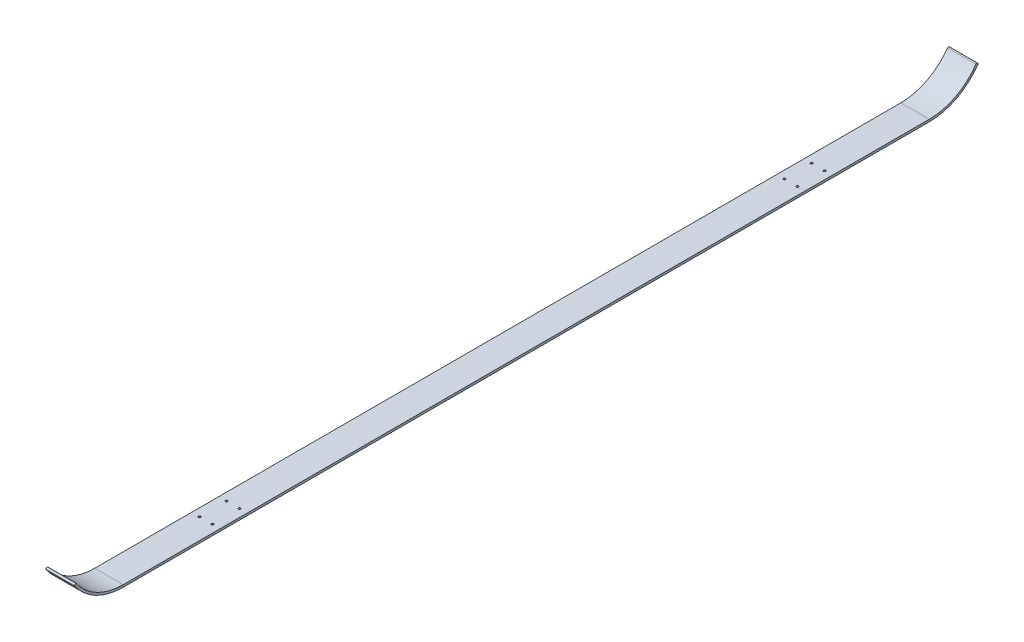
ISO-10303-21;
HEADER;
FILE_DESCRIPTION(('STEP AP214'),'2;1');
FILE_NAME('part.step','',(''),(''),'','','');
FILE_SCHEMA(('AUTOMOTIVE_DESIGN { 1 0 10303 214 1 1 1 1 }'));
ENDSEC;
DATA;
#1=APPLICATION_CONTEXT('core data for automotive mechanical design processes');
#2=APPLICATION_PROTOCOL_DEFINITION('international standard','automotive_design',2000,#1);
#3=PRODUCT_CONTEXT('',#1,'mechanical');
#4=PRODUCT('Part','Part','',(#3));
#5=PRODUCT_RELATED_PRODUCT_CATEGORY('part','',(#4));
#6=PRODUCT_DEFINITION_FORMATION('','',#4);
#7=PRODUCT_DEFINITION_CONTEXT('part definition',#1,'design');
#8=PRODUCT_DEFINITION('design','',#6,#7);
#9=PRODUCT_DEFINITION_SHAPE('','',#8);
#10=(LENGTH_UNIT() NAMED_UNIT(*) SI_UNIT(.MILLI.,.METRE.));
#11=(NAMED_UNIT(*) PLANE_ANGLE_UNIT() SI_UNIT($,.RADIAN.));
#12=(NAMED_UNIT(*) SI_UNIT($,.STERADIAN.) SOLID_ANGLE_UNIT());
#13=UNCERTAINTY_MEASURE_WITH_UNIT(LENGTH_MEASURE(1.E-05),#10,'distance_accuracy_value','');
#14=(GEOMETRIC_REPRESENTATION_CONTEXT(3) GLOBAL_UNCERTAINTY_ASSIGNED_CONTEXT((#13)) GLOBAL_UNIT_ASSIGNED_CONTEXT((#10,
#11,#12)) REPRESENTATION_CONTEXT('',''));
#15=CARTESIAN_POINT('',(0.,0.,0.));
#16=DIRECTION('',(0.,0.,1.));
#17=DIRECTION('',(1.,0.,0.));
#18=AXIS2_PLACEMENT_3D('',#15,#16,#17);
#19=CARTESIAN_POINT('',(0.,12.,0.));
#20=DIRECTION('',(0.,-1.,0.));
#21=DIRECTION('',(0.,0.,-1.));
#22=AXIS2_PLACEMENT_3D('',#19,#20,#21);
#23=PLANE('',#22);
#24=DIRECTION('',(0.,0.,-1.));
#25=VECTOR('',#24,1.);
#26=CARTESIAN_POINT('',(75.,12.,2024.));
#27=LINE('',#26,#25);
#28=CARTESIAN_POINT('',(75.,12.0000000000001,2124.));
#29=VERTEX_POINT('',#28);
#30=CARTESIAN_POINT('',(75.,12.0000000000001,-2124.));
#31=VERTEX_POINT('',#30);
#32=EDGE_CURVE('E41',#29,#31,#27,.T.);
#33=ORIENTED_EDGE('',*,*,#32,.T.);
#34=DIRECTION('',(1.,0.,0.));
#35=VECTOR('',#34,1.);
#36=CARTESIAN_POINT('',(-459.068847578424,12.0000000000001,-2124.));
#37=LINE('',#36,#35);
#38=CARTESIAN_POINT('',(-75.,12.0000000000001,-2124.));
#39=VERTEX_POINT('',#38);
#40=EDGE_CURVE('E108',#39,#31,#37,.T.);
#41=ORIENTED_EDGE('',*,*,#40,.F.);
#42=DIRECTION('',(0.,0.,1.));
#43=VECTOR('',#42,1.);
#44=CARTESIAN_POINT('',(-75.,12.,2024.));
#45=LINE('',#44,#43);
#46=CARTESIAN_POINT('',(-75.,12.0000000000001,2124.));
#47=VERTEX_POINT('',#46);
#48=EDGE_CURVE('E11',#39,#47,#45,.T.);
#49=ORIENTED_EDGE('',*,*,#48,.T.);
#50=DIRECTION('',(1.,0.,0.));
#51=VECTOR('',#50,1.);
#52=CARTESIAN_POINT('',(-459.068847578424,12.0000000000001,2124.));
#53=LINE('',#52,#51);
#54=EDGE_CURVE('E148',#47,#29,#53,.T.);
#55=ORIENTED_EDGE('',*,*,#54,.T.);
#56=EDGE_LOOP('',(#33,#41,#49,#55));
#57=FACE_BOUND('',#56,.T.);
#58=CARTESIAN_POINT('',(-34.2499999999996,12.,-1470.25));
#59=DIRECTION('',(0.,1.,0.));
#60=DIRECTION('',(0.,0.,1.));
#61=AXIS2_PLACEMENT_3D('',#58,#59,#60);
#62=CIRCLE('',#61,6.);
#63=CARTESIAN_POINT('',(-34.2499999999996,12.,-1464.25));
#64=VERTEX_POINT('',#63);
#65=EDGE_CURVE('E199',#64,#64,#62,.T.);
#66=ORIENTED_EDGE('',*,*,#65,.F.);
#67=EDGE_LOOP('',(#66));
#68=FACE_BOUND('',#67,.T.);
#69=CARTESIAN_POINT('',(34.2500000000004,12.,-1470.25));
#70=DIRECTION('',(0.,1.,0.));
#71=DIRECTION('',(0.,0.,1.));
#72=AXIS2_PLACEMENT_3D('',#69,#70,#71);
#73=CIRCLE('',#72,6.);
#74=CARTESIAN_POINT('',(34.2500000000004,12.,-1464.25));
#75=VERTEX_POINT('',#74);
#76=EDGE_CURVE('E193',#75,#75,#73,.T.);
#77=ORIENTED_EDGE('',*,*,#76,.F.);
#78=EDGE_LOOP('',(#77));
#79=FACE_BOUND('',#78,.T.);
#80=CARTESIAN_POINT('',(-34.2499999999996,12.,-1612.75));
#81=DIRECTION('',(0.,1.,0.));
#82=DIRECTION('',(0.,0.,1.));
#83=AXIS2_PLACEMENT_3D('',#80,#81,#82);
#84=CIRCLE('',#83,6.);
#85=CARTESIAN_POINT('',(-34.2499999999996,12.,-1606.75));
#86=VERTEX_POINT('',#85);
#87=EDGE_CURVE('E187',#86,#86,#84,.T.);
#88=ORIENTED_EDGE('',*,*,#87,.F.);
#89=EDGE_LOOP('',(#88));
#90=FACE_BOUND('',#89,.T.);
#91=CARTESIAN_POINT('',(34.2500000000004,12.,-1612.75));
#92=DIRECTION('',(0.,1.,0.));
#93=DIRECTION('',(0.,0.,1.));
#94=AXIS2_PLACEMENT_3D('',#91,#92,#93);
#95=CIRCLE('',#94,6.);
#96=CARTESIAN_POINT('',(34.2500000000004,12.,-1606.75));
#97=VERTEX_POINT('',#96);
#98=EDGE_CURVE('E181',#97,#97,#95,.T.);
#99=ORIENTED_EDGE('',*,*,#98,.F.);
#100=EDGE_LOOP('',(#99));
#101=FACE_BOUND('',#100,.T.);
#102=CARTESIAN_POINT('',(34.2500000000004,12.,1470.25));
#103=DIRECTION('',(0.,1.,0.));
#104=DIRECTION('',(0.,0.,-1.));
#105=AXIS2_PLACEMENT_3D('',#102,#103,#104);
#106=CIRCLE('',#105,6.);
#107=CARTESIAN_POINT('',(34.2500000000004,12.,1464.25));
#108=VERTEX_POINT('',#107);
#109=EDGE_CURVE('E175',#108,#108,#106,.T.);
#110=ORIENTED_EDGE('',*,*,#109,.F.);
#111=EDGE_LOOP('',(#110));
#112=FACE_BOUND('',#111,.T.);
#113=CARTESIAN_POINT('',(-34.2499999999996,12.,1470.25));
#114=DIRECTION('',(0.,1.,0.));
#115=DIRECTION('',(0.,0.,-1.));
#116=AXIS2_PLACEMENT_3D('',#113,#114,#115);
#117=CIRCLE('',#116,6.);
#118=CARTESIAN_POINT('',(-34.2499999999996,12.,1464.25));
#119=VERTEX_POINT('',#118);
#120=EDGE_CURVE('E169',#119,#119,#117,.T.);
#121=ORIENTED_EDGE('',*,*,#120,.F.);
#122=EDGE_LOOP('',(#121));
#123=FACE_BOUND('',#122,.T.);
#124=CARTESIAN_POINT('',(34.2500000000004,12.,1612.75));
#125=DIRECTION('',(0.,1.,0.));
#126=DIRECTION('',(0.,0.,-1.));
#127=AXIS2_PLACEMENT_3D('',#124,#125,#126);
#128=CIRCLE('',#127,6.);
#129=CARTESIAN_POINT('',(34.2500000000004,12.,1606.75));
#130=VERTEX_POINT('',#129);
#131=EDGE_CURVE('E163',#130,#130,#128,.T.);
#132=ORIENTED_EDGE('',*,*,#131,.F.);
#133=EDGE_LOOP('',(#132));
#134=FACE_BOUND('',#133,.T.);
#135=CARTESIAN_POINT('',(-34.2499999999996,12.,1612.75));
#136=DIRECTION('',(0.,1.,0.));
#137=DIRECTION('',(0.,0.,-1.));
#138=AXIS2_PLACEMENT_3D('',#135,#136,#137);
#139=CIRCLE('',#138,6.);
#140=CARTESIAN_POINT('',(-34.2499999999996,12.,1606.75));
#141=VERTEX_POINT('',#140);
#142=EDGE_CURVE('E157',#141,#141,#139,.T.);
#143=ORIENTED_EDGE('',*,*,#142,.F.);
#144=EDGE_LOOP('',(#143));
#145=FACE_BOUND('',#144,.T.);
#146=ADVANCED_FACE('F32',(#57,#68,#79,#90,#101,#112,#123,#134,#145),#23,.F.);
#147=CARTESIAN_POINT('',(0.,0.,0.));
#148=DIRECTION('',(0.,-1.,0.));
#149=DIRECTION('',(0.,0.,-1.));
#150=AXIS2_PLACEMENT_3D('',#147,#148,#149);
#151=PLANE('',#150);
#152=CARTESIAN_POINT('',(34.2500000000004,0.,1612.75));
#153=DIRECTION('',(0.,1.,0.));
#154=DIRECTION('',(0.,0.,-1.));
#155=AXIS2_PLACEMENT_3D('',#152,#153,#154);
#156=CIRCLE('',#155,6.);
#157=CARTESIAN_POINT('',(34.2500000000004,0.,1606.75));
#158=VERTEX_POINT('',#157);
#159=EDGE_CURVE('E160',#158,#158,#156,.T.);
#160=ORIENTED_EDGE('',*,*,#159,.T.);
#161=EDGE_LOOP('',(#160));
#162=FACE_BOUND('',#161,.T.);
#163=CARTESIAN_POINT('',(34.2500000000004,0.,1470.25));
#164=DIRECTION('',(0.,1.,0.));
#165=DIRECTION('',(0.,0.,-1.));
#166=AXIS2_PLACEMENT_3D('',#163,#164,#165);
#167=CIRCLE('',#166,6.);
#168=CARTESIAN_POINT('',(34.2500000000004,0.,1464.25));
#169=VERTEX_POINT('',#168);
#170=EDGE_CURVE('E172',#169,#169,#167,.T.);
#171=ORIENTED_EDGE('',*,*,#170,.T.);
#172=EDGE_LOOP('',(#171));
#173=FACE_BOUND('',#172,.T.);
#174=CARTESIAN_POINT('',(-34.2499999999996,0.,-1612.75));
#175=DIRECTION('',(0.,1.,0.));
#176=DIRECTION('',(0.,0.,1.));
#177=AXIS2_PLACEMENT_3D('',#174,#175,#176);
#178=CIRCLE('',#177,6.);
#179=CARTESIAN_POINT('',(-34.2499999999996,0.,-1606.75));
#180=VERTEX_POINT('',#179);
#181=EDGE_CURVE('E184',#180,#180,#178,.T.);
#182=ORIENTED_EDGE('',*,*,#181,.T.);
#183=EDGE_LOOP('',(#182));
#184=FACE_BOUND('',#183,.T.);
#185=CARTESIAN_POINT('',(-34.2499999999996,0.,-1470.25));
#186=DIRECTION('',(0.,1.,0.));
#187=DIRECTION('',(0.,0.,1.));
#188=AXIS2_PLACEMENT_3D('',#185,#186,#187);
#189=CIRCLE('',#188,6.);
#190=CARTESIAN_POINT('',(-34.2499999999996,0.,-1464.25));
#191=VERTEX_POINT('',#190);
#192=EDGE_CURVE('E196',#191,#191,#189,.T.);
#193=ORIENTED_EDGE('',*,*,#192,.T.);
#194=EDGE_LOOP('',(#193));
#195=FACE_BOUND('',#194,.T.);
#196=DIRECTION('',(0.,0.,-1.));
#197=VECTOR('',#196,1.);
#198=CARTESIAN_POINT('',(75.,0.,2024.));
#199=LINE('',#198,#197);
#200=CARTESIAN_POINT('',(75.,0.,2124.));
#201=VERTEX_POINT('',#200);
#202=CARTESIAN_POINT('',(75.,0.,-2124.));
#203=VERTEX_POINT('',#202);
#204=EDGE_CURVE('E202',#201,#203,#199,.T.);
#205=ORIENTED_EDGE('',*,*,#204,.F.);
#206=DIRECTION('',(1.,0.,0.));
#207=VECTOR('',#206,1.);
#208=CARTESIAN_POINT('',(-459.068847578424,0.,2124.));
#209=LINE('',#208,#207);
#210=CARTESIAN_POINT('',(-75.,0.,2124.));
#211=VERTEX_POINT('',#210);
#212=EDGE_CURVE('E136',#211,#201,#209,.T.);
#213=ORIENTED_EDGE('',*,*,#212,.F.);
#214=DIRECTION('',(0.,0.,1.));
#215=VECTOR('',#214,1.);
#216=CARTESIAN_POINT('',(-75.,0.,2024.));
#217=LINE('',#216,#215);
#218=CARTESIAN_POINT('',(-75.,0.,-2124.));
#219=VERTEX_POINT('',#218);
#220=EDGE_CURVE('E36',#219,#211,#217,.T.);
#221=ORIENTED_EDGE('',*,*,#220,.F.);
#222=DIRECTION('',(1.,0.,0.));
#223=VECTOR('',#222,1.);
#224=CARTESIAN_POINT('',(-459.068847578424,0.,-2124.));
#225=LINE('',#224,#223);
#226=EDGE_CURVE('E127',#219,#203,#225,.T.);
#227=ORIENTED_EDGE('',*,*,#226,.T.);
#228=EDGE_LOOP('',(#205,#213,#221,#227));
#229=FACE_BOUND('',#228,.T.);
#230=CARTESIAN_POINT('',(34.2500000000004,0.,-1470.25));
#231=DIRECTION('',(0.,1.,0.));
#232=DIRECTION('',(0.,0.,1.));
#233=AXIS2_PLACEMENT_3D('',#230,#231,#232);
#234=CIRCLE('',#233,6.);
#235=CARTESIAN_POINT('',(34.2500000000004,0.,-1464.25));
#236=VERTEX_POINT('',#235);
#237=EDGE_CURVE('E190',#236,#236,#234,.T.);
#238=ORIENTED_EDGE('',*,*,#237,.T.);
#239=EDGE_LOOP('',(#238));
#240=FACE_BOUND('',#239,.T.);
#241=CARTESIAN_POINT('',(34.2500000000004,0.,-1612.75));
#242=DIRECTION('',(0.,1.,0.));
#243=DIRECTION('',(0.,0.,1.));
#244=AXIS2_PLACEMENT_3D('',#241,#242,#243);
#245=CIRCLE('',#244,6.);
#246=CARTESIAN_POINT('',(34.2500000000004,0.,-1606.75));
#247=VERTEX_POINT('',#246);
#248=EDGE_CURVE('E178',#247,#247,#245,.T.);
#249=ORIENTED_EDGE('',*,*,#248,.T.);
#250=EDGE_LOOP('',(#249));
#251=FACE_BOUND('',#250,.T.);
#252=CARTESIAN_POINT('',(-34.2499999999996,0.,1470.25));
#253=DIRECTION('',(0.,1.,0.));
#254=DIRECTION('',(0.,0.,-1.));
#255=AXIS2_PLACEMENT_3D('',#252,#253,#254);
#256=CIRCLE('',#255,6.);
#257=CARTESIAN_POINT('',(-34.2499999999996,0.,1464.25));
#258=VERTEX_POINT('',#257);
#259=EDGE_CURVE('E166',#258,#258,#256,.T.);
#260=ORIENTED_EDGE('',*,*,#259,.T.);
#261=EDGE_LOOP('',(#260));
#262=FACE_BOUND('',#261,.T.);
#263=CARTESIAN_POINT('',(-34.2499999999996,0.,1612.75));
#264=DIRECTION('',(0.,1.,0.));
#265=DIRECTION('',(0.,0.,-1.));
#266=AXIS2_PLACEMENT_3D('',#263,#264,#265);
#267=CIRCLE('',#266,6.);
#268=CARTESIAN_POINT('',(-34.2499999999996,0.,1606.75));
#269=VERTEX_POINT('',#268);
#270=EDGE_CURVE('E139',#269,#269,#267,.T.);
#271=ORIENTED_EDGE('',*,*,#270,.T.);
#272=EDGE_LOOP('',(#271));
#273=FACE_BOUND('',#272,.T.);
#274=ADVANCED_FACE('F215',(#162,#173,#184,#195,#229,#240,#251,#262,#273),#151,.T.);
#275=CARTESIAN_POINT('',(75.,12.,2024.));
#276=DIRECTION('',(-1.,0.,0.));
#277=DIRECTION('',(0.,0.,1.));
#278=AXIS2_PLACEMENT_3D('',#275,#276,#277);
#279=PLANE('',#278);
#280=ORIENTED_EDGE('',*,*,#204,.T.);
#281=CARTESIAN_POINT('',(75.,312.,-2124.));
#282=DIRECTION('',(1.,0.,0.));
#283=DIRECTION('',(0.,0.,1.));
#284=AXIS2_PLACEMENT_3D('',#281,#282,#283);
#285=CIRCLE('',#284,312.);
#286=CARTESIAN_POINT('',(75.,133.044151858472,-2379.57543781816));
#287=VERTEX_POINT('',#286);
#288=EDGE_CURVE('E109',#203,#287,#285,.T.);
#289=ORIENTED_EDGE('',*,*,#288,.T.);
#290=CARTESIAN_POINT('',(75.,136.485610476579,-2374.66052555243));
#291=DIRECTION('',(1.,0.,0.));
#292=DIRECTION('',(0.,0.,1.));
#293=AXIS2_PLACEMENT_3D('',#290,#291,#292);
#294=CIRCLE('',#293,5.99999999999998);
#295=CARTESIAN_POINT('',(75.,139.927069094685,-2369.7456132867));
#296=VERTEX_POINT('',#295);
#297=EDGE_CURVE('E103',#287,#296,#294,.T.);
#298=ORIENTED_EDGE('',*,*,#297,.T.);
#299=CARTESIAN_POINT('',(75.,312.,-2124.));
#300=DIRECTION('',(-1.,0.,0.));
#301=DIRECTION('',(0.,0.,1.));
#302=AXIS2_PLACEMENT_3D('',#299,#300,#301);
#303=CIRCLE('',#302,300.);
#304=EDGE_CURVE('E113',#296,#31,#303,.T.);
#305=ORIENTED_EDGE('',*,*,#304,.T.);
#306=ORIENTED_EDGE('',*,*,#32,.F.);
#307=CARTESIAN_POINT('',(75.,312.,2124.));
#308=DIRECTION('',(-1.,0.,0.));
#309=DIRECTION('',(0.,0.,-1.));
#310=AXIS2_PLACEMENT_3D('',#307,#308,#309);
#311=CIRCLE('',#310,300.);
#312=CARTESIAN_POINT('',(75.,139.927069094685,2369.7456132867));
#313=VERTEX_POINT('',#312);
#314=EDGE_CURVE('E133',#29,#313,#311,.T.);
#315=ORIENTED_EDGE('',*,*,#314,.T.);
#316=CARTESIAN_POINT('',(75.,136.485610476579,2374.66052555243));
#317=DIRECTION('',(1.,0.,0.));
#318=DIRECTION('',(0.,0.,-1.));
#319=AXIS2_PLACEMENT_3D('',#316,#317,#318);
#320=CIRCLE('',#319,5.99999999999998);
#321=CARTESIAN_POINT('',(75.,133.044151858472,2379.57543781816));
#322=VERTEX_POINT('',#321);
#323=EDGE_CURVE('E142',#313,#322,#320,.T.);
#324=ORIENTED_EDGE('',*,*,#323,.T.);
#325=CARTESIAN_POINT('',(75.,312.,2124.));
#326=DIRECTION('',(1.,0.,0.));
#327=DIRECTION('',(0.,0.,-1.));
#328=AXIS2_PLACEMENT_3D('',#325,#326,#327);
#329=CIRCLE('',#328,312.);
#330=EDGE_CURVE('E145',#322,#201,#329,.T.);
#331=ORIENTED_EDGE('',*,*,#330,.T.);
#332=EDGE_LOOP('',(#280,#289,#298,#305,#306,#315,#324,#331));
#333=FACE_BOUND('',#332,.T.);
#334=ADVANCED_FACE('F34',(#333),#279,.F.);
#335=CARTESIAN_POINT('',(-75.,12.,2024.));
#336=DIRECTION('',(1.,0.,0.));
#337=DIRECTION('',(0.,0.,-1.));
#338=AXIS2_PLACEMENT_3D('',#335,#336,#337);
#339=PLANE('',#338);
#340=ORIENTED_EDGE('',*,*,#220,.T.);
#341=CARTESIAN_POINT('',(-75.,312.,2124.));
#342=DIRECTION('',(1.,0.,0.));
#343=DIRECTION('',(0.,0.,-1.));
#344=AXIS2_PLACEMENT_3D('',#341,#342,#343);
#345=CIRCLE('',#344,312.);
#346=CARTESIAN_POINT('',(-75.,133.044151858472,2379.57543781816));
#347=VERTEX_POINT('',#346);
#348=EDGE_CURVE('E54',#211,#347,#345,.F.);
#349=ORIENTED_EDGE('',*,*,#348,.T.);
#350=CARTESIAN_POINT('',(-75.,136.485610476579,2374.66052555243));
#351=DIRECTION('',(1.,0.,0.));
#352=DIRECTION('',(0.,0.,-1.));
#353=AXIS2_PLACEMENT_3D('',#350,#351,#352);
#354=CIRCLE('',#353,5.99999999999998);
#355=CARTESIAN_POINT('',(-75.,139.927069094685,2369.7456132867));
#356=VERTEX_POINT('',#355);
#357=EDGE_CURVE('E49',#347,#356,#354,.F.);
#358=ORIENTED_EDGE('',*,*,#357,.T.);
#359=CARTESIAN_POINT('',(-75.,312.,2124.));
#360=DIRECTION('',(1.,0.,0.));
#361=DIRECTION('',(0.,0.,-1.));
#362=AXIS2_PLACEMENT_3D('',#359,#360,#361);
#363=CIRCLE('',#362,300.);
#364=EDGE_CURVE('E134',#356,#47,#363,.T.);
#365=ORIENTED_EDGE('',*,*,#364,.T.);
#366=ORIENTED_EDGE('',*,*,#48,.F.);
#367=CARTESIAN_POINT('',(-75.,312.,-2124.));
#368=DIRECTION('',(1.,0.,0.));
#369=DIRECTION('',(0.,0.,-1.));
#370=AXIS2_PLACEMENT_3D('',#367,#368,#369);
#371=CIRCLE('',#370,300.);
#372=CARTESIAN_POINT('',(-75.,139.927069094685,-2369.7456132867));
#373=VERTEX_POINT('',#372);
#374=EDGE_CURVE('E131',#39,#373,#371,.T.);
#375=ORIENTED_EDGE('',*,*,#374,.T.);
#376=CARTESIAN_POINT('',(-75.,136.485610476579,-2374.66052555243));
#377=DIRECTION('',(1.,0.,0.));
#378=DIRECTION('',(0.,0.,-1.));
#379=AXIS2_PLACEMENT_3D('',#376,#377,#378);
#380=CIRCLE('',#379,5.99999999999998);
#381=CARTESIAN_POINT('',(-75.,133.044151858472,-2379.57543781816));
#382=VERTEX_POINT('',#381);
#383=EDGE_CURVE('E105',#373,#382,#380,.F.);
#384=ORIENTED_EDGE('',*,*,#383,.T.);
#385=CARTESIAN_POINT('',(-75.,312.,-2124.));
#386=DIRECTION('',(1.,0.,0.));
#387=DIRECTION('',(0.,0.,-1.));
#388=AXIS2_PLACEMENT_3D('',#385,#386,#387);
#389=CIRCLE('',#388,312.);
#390=EDGE_CURVE('E126',#382,#219,#389,.F.);
#391=ORIENTED_EDGE('',*,*,#390,.T.);
#392=EDGE_LOOP('',(#340,#349,#358,#365,#366,#375,#384,#391));
#393=FACE_BOUND('',#392,.T.);
#394=ADVANCED_FACE('F206',(#393),#339,.F.);
#395=CARTESIAN_POINT('',(-34.2499999999996,12.,-1470.25));
#396=DIRECTION('',(0.,-1.,0.));
#397=DIRECTION('',(0.,0.,-1.));
#398=AXIS2_PLACEMENT_3D('',#395,#396,#397);
#399=CYLINDRICAL_SURFACE('',#398,6.);
#400=ORIENTED_EDGE('',*,*,#65,.T.);
#401=EDGE_LOOP('',(#400));
#402=FACE_BOUND('',#401,.T.);
#403=ORIENTED_EDGE('',*,*,#192,.F.);
#404=EDGE_LOOP('',(#403));
#405=FACE_BOUND('',#404,.T.);
#406=ADVANCED_FACE('F246',(#402,#405),#399,.F.);
#407=CARTESIAN_POINT('',(34.2500000000004,12.,-1470.25));
#408=DIRECTION('',(0.,-1.,0.));
#409=DIRECTION('',(0.,0.,-1.));
#410=AXIS2_PLACEMENT_3D('',#407,#408,#409);
#411=CYLINDRICAL_SURFACE('',#410,6.);
#412=ORIENTED_EDGE('',*,*,#76,.T.);
#413=EDGE_LOOP('',(#412));
#414=FACE_BOUND('',#413,.T.);
#415=ORIENTED_EDGE('',*,*,#237,.F.);
#416=EDGE_LOOP('',(#415));
#417=FACE_BOUND('',#416,.T.);
#418=ADVANCED_FACE('F253',(#414,#417),#411,.F.);
#419=CARTESIAN_POINT('',(-34.2499999999996,12.,-1612.75));
#420=DIRECTION('',(0.,-1.,0.));
#421=DIRECTION('',(0.,0.,-1.));
#422=AXIS2_PLACEMENT_3D('',#419,#420,#421);
#423=CYLINDRICAL_SURFACE('',#422,6.);
#424=ORIENTED_EDGE('',*,*,#87,.T.);
#425=EDGE_LOOP('',(#424));
#426=FACE_BOUND('',#425,.T.);
#427=ORIENTED_EDGE('',*,*,#181,.F.);
#428=EDGE_LOOP('',(#427));
#429=FACE_BOUND('',#428,.T.);
#430=ADVANCED_FACE('F317',(#426,#429),#423,.F.);
#431=CARTESIAN_POINT('',(34.2500000000004,12.,-1612.75));
#432=DIRECTION('',(0.,-1.,0.));
#433=DIRECTION('',(0.,0.,-1.));
#434=AXIS2_PLACEMENT_3D('',#431,#432,#433);
#435=CYLINDRICAL_SURFACE('',#434,6.);
#436=ORIENTED_EDGE('',*,*,#98,.T.);
#437=EDGE_LOOP('',(#436));
#438=FACE_BOUND('',#437,.T.);
#439=ORIENTED_EDGE('',*,*,#248,.F.);
#440=EDGE_LOOP('',(#439));
#441=FACE_BOUND('',#440,.T.);
#442=ADVANCED_FACE('F307',(#438,#441),#435,.F.);
#443=CARTESIAN_POINT('',(34.2500000000004,12.,1470.25));
#444=DIRECTION('',(0.,-1.,0.));
#445=DIRECTION('',(0.,0.,-1.));
#446=AXIS2_PLACEMENT_3D('',#443,#444,#445);
#447=CYLINDRICAL_SURFACE('',#446,6.);
#448=ORIENTED_EDGE('',*,*,#109,.T.);
#449=EDGE_LOOP('',(#448));
#450=FACE_BOUND('',#449,.T.);
#451=ORIENTED_EDGE('',*,*,#170,.F.);
#452=EDGE_LOOP('',(#451));
#453=FACE_BOUND('',#452,.T.);
#454=ADVANCED_FACE('F297',(#450,#453),#447,.F.);
#455=CARTESIAN_POINT('',(-34.2499999999996,12.,1470.25));
#456=DIRECTION('',(0.,-1.,0.));
#457=DIRECTION('',(0.,0.,-1.));
#458=AXIS2_PLACEMENT_3D('',#455,#456,#457);
#459=CYLINDRICAL_SURFACE('',#458,6.);
#460=ORIENTED_EDGE('',*,*,#120,.T.);
#461=EDGE_LOOP('',(#460));
#462=FACE_BOUND('',#461,.T.);
#463=ORIENTED_EDGE('',*,*,#259,.F.);
#464=EDGE_LOOP('',(#463));
#465=FACE_BOUND('',#464,.T.);
#466=ADVANCED_FACE('F287',(#462,#465),#459,.F.);
#467=CARTESIAN_POINT('',(34.2500000000004,12.,1612.75));
#468=DIRECTION('',(0.,-1.,0.));
#469=DIRECTION('',(0.,0.,-1.));
#470=AXIS2_PLACEMENT_3D('',#467,#468,#469);
#471=CYLINDRICAL_SURFACE('',#470,6.);
#472=ORIENTED_EDGE('',*,*,#131,.T.);
#473=EDGE_LOOP('',(#472));
#474=FACE_BOUND('',#473,.T.);
#475=ORIENTED_EDGE('',*,*,#159,.F.);
#476=EDGE_LOOP('',(#475));
#477=FACE_BOUND('',#476,.T.);
#478=ADVANCED_FACE('F277',(#474,#477),#471,.F.);
#479=CARTESIAN_POINT('',(-34.2499999999996,12.,1612.75));
#480=DIRECTION('',(0.,-1.,0.));
#481=DIRECTION('',(0.,0.,-1.));
#482=AXIS2_PLACEMENT_3D('',#479,#480,#481);
#483=CYLINDRICAL_SURFACE('',#482,6.);
#484=ORIENTED_EDGE('',*,*,#142,.T.);
#485=EDGE_LOOP('',(#484));
#486=FACE_BOUND('',#485,.T.);
#487=ORIENTED_EDGE('',*,*,#270,.F.);
#488=EDGE_LOOP('',(#487));
#489=FACE_BOUND('',#488,.T.);
#490=ADVANCED_FACE('F236',(#486,#489),#483,.F.);
#491=CARTESIAN_POINT('',(-459.068847578424,312.,2124.));
#492=DIRECTION('',(1.,0.,0.));
#493=DIRECTION('',(0.,0.,-1.));
#494=AXIS2_PLACEMENT_3D('',#491,#492,#493);
#495=CYLINDRICAL_SURFACE('',#494,312.);
#496=ORIENTED_EDGE('',*,*,#348,.F.);
#497=ORIENTED_EDGE('',*,*,#212,.T.);
#498=ORIENTED_EDGE('',*,*,#330,.F.);
#499=DIRECTION('',(1.,0.,0.));
#500=VECTOR('',#499,1.);
#501=CARTESIAN_POINT('',(-459.068847578424,133.044151858472,2379.57543781816));
#502=LINE('',#501,#500);
#503=EDGE_CURVE('E151',#347,#322,#502,.T.);
#504=ORIENTED_EDGE('',*,*,#503,.F.);
#505=EDGE_LOOP('',(#496,#497,#498,#504));
#506=FACE_BOUND('',#505,.T.);
#507=ADVANCED_FACE('F213',(#506),#495,.T.);
#508=CARTESIAN_POINT('',(-459.068847578424,136.485610476579,2374.66052555243));
#509=DIRECTION('',(1.,0.,0.));
#510=DIRECTION('',(0.,0.,-1.));
#511=AXIS2_PLACEMENT_3D('',#508,#509,#510);
#512=CYLINDRICAL_SURFACE('',#511,5.99999999999998);
#513=ORIENTED_EDGE('',*,*,#357,.F.);
#514=ORIENTED_EDGE('',*,*,#503,.T.);
#515=ORIENTED_EDGE('',*,*,#323,.F.);
#516=DIRECTION('',(1.,0.,0.));
#517=VECTOR('',#516,1.);
#518=CARTESIAN_POINT('',(-459.068847578424,139.927069094685,2369.7456132867));
#519=LINE('',#518,#517);
#520=EDGE_CURVE('E153',#356,#313,#519,.T.);
#521=ORIENTED_EDGE('',*,*,#520,.F.);
#522=EDGE_LOOP('',(#513,#514,#515,#521));
#523=FACE_BOUND('',#522,.T.);
#524=ADVANCED_FACE('F228',(#523),#512,.T.);
#525=CARTESIAN_POINT('',(-459.068847578424,312.,2124.));
#526=DIRECTION('',(1.,0.,0.));
#527=DIRECTION('',(0.,0.,-1.));
#528=AXIS2_PLACEMENT_3D('',#525,#526,#527);
#529=CYLINDRICAL_SURFACE('',#528,300.);
#530=ORIENTED_EDGE('',*,*,#364,.F.);
#531=ORIENTED_EDGE('',*,*,#520,.T.);
#532=ORIENTED_EDGE('',*,*,#314,.F.);
#533=ORIENTED_EDGE('',*,*,#54,.F.);
#534=EDGE_LOOP('',(#530,#531,#532,#533));
#535=FACE_BOUND('',#534,.T.);
#536=ADVANCED_FACE('F225',(#535),#529,.F.);
#537=CARTESIAN_POINT('',(-459.068847578424,136.485610476579,-2374.66052555243));
#538=DIRECTION('',(1.,0.,0.));
#539=DIRECTION('',(0.,0.,-1.));
#540=AXIS2_PLACEMENT_3D('',#537,#538,#539);
#541=CYLINDRICAL_SURFACE('',#540,5.99999999999998);
#542=ORIENTED_EDGE('',*,*,#383,.F.);
#543=DIRECTION('',(1.,0.,0.));
#544=VECTOR('',#543,1.);
#545=CARTESIAN_POINT('',(-459.068847578424,139.927069094685,-2369.7456132867));
#546=LINE('',#545,#544);
#547=EDGE_CURVE('E98',#373,#296,#546,.T.);
#548=ORIENTED_EDGE('',*,*,#547,.T.);
#549=ORIENTED_EDGE('',*,*,#297,.F.);
#550=DIRECTION('',(1.,0.,0.));
#551=VECTOR('',#550,1.);
#552=CARTESIAN_POINT('',(-459.068847578424,133.044151858472,-2379.57543781816));
#553=LINE('',#552,#551);
#554=EDGE_CURVE('E124',#382,#287,#553,.T.);
#555=ORIENTED_EDGE('',*,*,#554,.F.);
#556=EDGE_LOOP('',(#542,#548,#549,#555));
#557=FACE_BOUND('',#556,.T.);
#558=ADVANCED_FACE('F100',(#557),#541,.T.);
#559=CARTESIAN_POINT('',(-459.068847578424,312.,-2124.));
#560=DIRECTION('',(1.,0.,0.));
#561=DIRECTION('',(0.,0.,-1.));
#562=AXIS2_PLACEMENT_3D('',#559,#560,#561);
#563=CYLINDRICAL_SURFACE('',#562,312.);
#564=ORIENTED_EDGE('',*,*,#390,.F.);
#565=ORIENTED_EDGE('',*,*,#554,.T.);
#566=ORIENTED_EDGE('',*,*,#288,.F.);
#567=ORIENTED_EDGE('',*,*,#226,.F.);
#568=EDGE_LOOP('',(#564,#565,#566,#567));
#569=FACE_BOUND('',#568,.T.);
#570=ADVANCED_FACE('F218',(#569),#563,.T.);
#571=CARTESIAN_POINT('',(-459.068847578424,312.,-2124.));
#572=DIRECTION('',(1.,0.,0.));
#573=DIRECTION('',(0.,0.,-1.));
#574=AXIS2_PLACEMENT_3D('',#571,#572,#573);
#575=CYLINDRICAL_SURFACE('',#574,300.);
#576=ORIENTED_EDGE('',*,*,#374,.F.);
#577=ORIENTED_EDGE('',*,*,#40,.T.);
#578=ORIENTED_EDGE('',*,*,#304,.F.);
#579=ORIENTED_EDGE('',*,*,#547,.F.);
#580=EDGE_LOOP('',(#576,#577,#578,#579));
#581=FACE_BOUND('',#580,.T.);
#582=ADVANCED_FACE('F114',(#581),#575,.F.);
#583=CLOSED_SHELL('',(#146,#274,#334,#394,#406,#418,#430,#442,#454,#466,#478,#490,#507,#524,
#536,#558,#570,#582));
#584=MANIFOLD_SOLID_BREP('B2',#583);
#585=ADVANCED_BREP_SHAPE_REPRESENTATION('',(#18,#584),#14);
#586=SHAPE_DEFINITION_REPRESENTATION(#9,#585);
ENDSEC;
END-ISO-10303-21;
